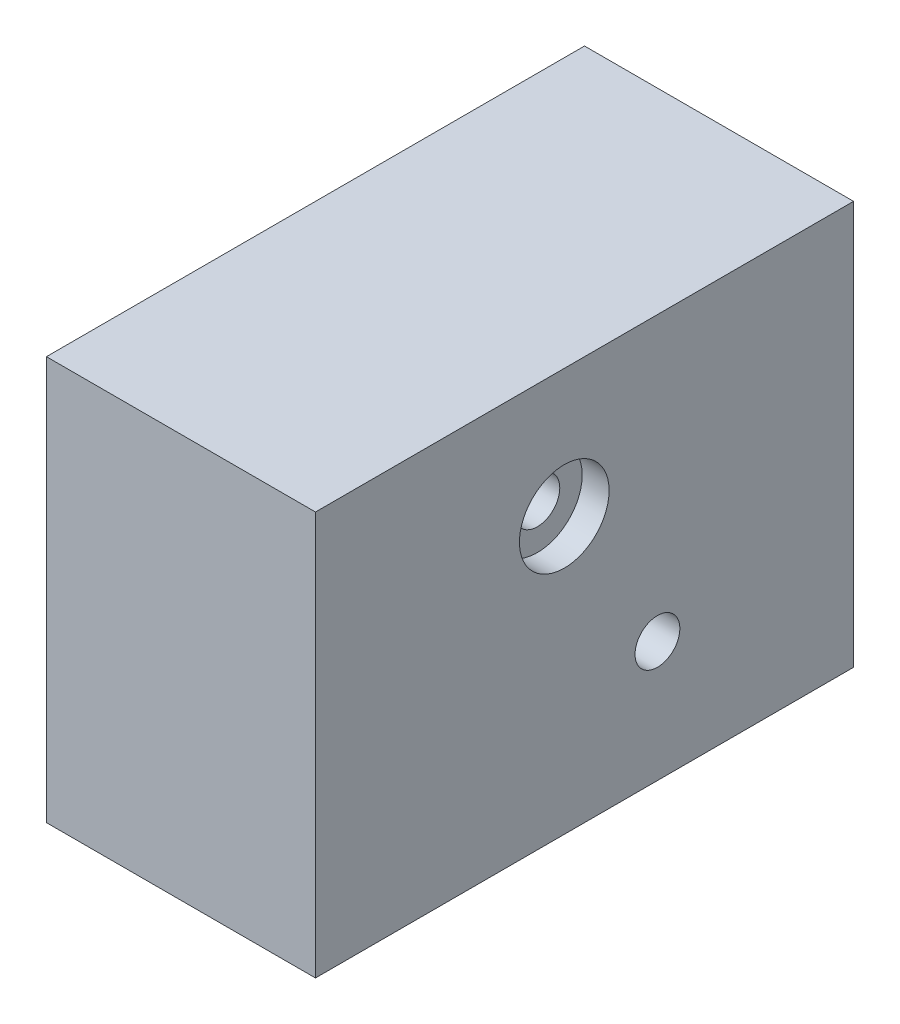
ISO-10303-21;
HEADER;
FILE_DESCRIPTION(('STEP AP214'),'2;1');
FILE_NAME('part.step','',(''),(''),'','','');
FILE_SCHEMA(('AUTOMOTIVE_DESIGN { 1 0 10303 214 1 1 1 1 }'));
ENDSEC;
DATA;
#1=APPLICATION_CONTEXT('core data for automotive mechanical design processes');
#2=APPLICATION_PROTOCOL_DEFINITION('international standard','automotive_design',2000,#1);
#3=PRODUCT_CONTEXT('',#1,'mechanical');
#4=PRODUCT('Part','Part','',(#3));
#5=PRODUCT_RELATED_PRODUCT_CATEGORY('part','',(#4));
#6=PRODUCT_DEFINITION_FORMATION('','',#4);
#7=PRODUCT_DEFINITION_CONTEXT('part definition',#1,'design');
#8=PRODUCT_DEFINITION('design','',#6,#7);
#9=PRODUCT_DEFINITION_SHAPE('','',#8);
#10=(LENGTH_UNIT() NAMED_UNIT(*) SI_UNIT(.MILLI.,.METRE.));
#11=(NAMED_UNIT(*) PLANE_ANGLE_UNIT() SI_UNIT($,.RADIAN.));
#12=(NAMED_UNIT(*) SI_UNIT($,.STERADIAN.) SOLID_ANGLE_UNIT());
#13=UNCERTAINTY_MEASURE_WITH_UNIT(LENGTH_MEASURE(1.E-05),#10,'distance_accuracy_value','');
#14=(GEOMETRIC_REPRESENTATION_CONTEXT(3) GLOBAL_UNCERTAINTY_ASSIGNED_CONTEXT((#13)) GLOBAL_UNIT_ASSIGNED_CONTEXT((#10,
#11,#12)) REPRESENTATION_CONTEXT('',''));
#15=CARTESIAN_POINT('',(0.,0.,0.));
#16=DIRECTION('',(0.,0.,1.));
#17=DIRECTION('',(1.,0.,0.));
#18=AXIS2_PLACEMENT_3D('',#15,#16,#17);
#19=CARTESIAN_POINT('',(-1.2E-05,85.7051553940905,122.259205921495));
#20=DIRECTION('',(1.,0.,0.));
#21=DIRECTION('',(0.,0.,-1.));
#22=AXIS2_PLACEMENT_3D('',#19,#20,#21);
#23=CYLINDRICAL_SURFACE('',#22,2.50000000000001);
#24=CARTESIAN_POINT('',(0.,85.7051553940905,122.259205921495));
#25=DIRECTION('',(1.,0.,0.));
#26=DIRECTION('',(0.,0.,-1.));
#27=AXIS2_PLACEMENT_3D('',#24,#25,#26);
#28=CIRCLE('',#27,2.50000000000001);
#29=CARTESIAN_POINT('',(0.,85.7051553940905,119.759205921495));
#30=VERTEX_POINT('',#29);
#31=EDGE_CURVE('E105',#30,#30,#28,.T.);
#32=CARTESIAN_POINT('',(27.,85.7051553940905,122.259205921495));
#33=DIRECTION('',(1.,0.,0.));
#34=DIRECTION('',(0.,0.,-1.));
#35=AXIS2_PLACEMENT_3D('',#32,#33,#34);
#36=CIRCLE('',#35,2.50000000000001);
#37=CARTESIAN_POINT('',(27.,85.7051553940905,119.759205921495));
#38=VERTEX_POINT('',#37);
#39=EDGE_CURVE('E39',#38,#38,#36,.F.);
#40=CARTESIAN_POINT('',(0.,85.7051553940905,119.759205921495));
#41=CARTESIAN_POINT('',(0.28125,85.7051553940905,119.759205921495));
#42=CARTESIAN_POINT('',(0.5625,85.7051553940905,119.759205921495));
#43=CARTESIAN_POINT('',(1.125,85.7051553940905,119.759205921495));
#44=CARTESIAN_POINT('',(1.40625,85.7051553940905,119.759205921495));
#45=CARTESIAN_POINT('',(1.96875,85.7051553940905,119.759205921495));
#46=CARTESIAN_POINT('',(2.25,85.7051553940905,119.759205921495));
#47=CARTESIAN_POINT('',(2.8125,85.7051553940905,119.759205921495));
#48=CARTESIAN_POINT('',(3.09375,85.7051553940905,119.759205921495));
#49=CARTESIAN_POINT('',(3.65625,85.7051553940905,119.759205921495));
#50=CARTESIAN_POINT('',(3.9375,85.7051553940905,119.759205921495));
#51=CARTESIAN_POINT('',(4.5,85.7051553940905,119.759205921495));
#52=CARTESIAN_POINT('',(4.78125,85.7051553940905,119.759205921495));
#53=CARTESIAN_POINT('',(5.34375,85.7051553940905,119.759205921495));
#54=CARTESIAN_POINT('',(5.625,85.7051553940905,119.759205921495));
#55=CARTESIAN_POINT('',(6.1875,85.7051553940905,119.759205921495));
#56=CARTESIAN_POINT('',(6.46875,85.7051553940905,119.759205921495));
#57=CARTESIAN_POINT('',(7.03125,85.7051553940905,119.759205921495));
#58=CARTESIAN_POINT('',(7.3125,85.7051553940905,119.759205921495));
#59=CARTESIAN_POINT('',(7.875,85.7051553940905,119.759205921495));
#60=CARTESIAN_POINT('',(8.15625,85.7051553940905,119.759205921495));
#61=CARTESIAN_POINT('',(8.71875,85.7051553940905,119.759205921495));
#62=CARTESIAN_POINT('',(9.,85.7051553940905,119.759205921495));
#63=CARTESIAN_POINT('',(9.5625,85.7051553940905,119.759205921495));
#64=CARTESIAN_POINT('',(9.84375,85.7051553940905,119.759205921495));
#65=CARTESIAN_POINT('',(10.40625,85.7051553940905,119.759205921495));
#66=CARTESIAN_POINT('',(10.6875,85.7051553940905,119.759205921495));
#67=CARTESIAN_POINT('',(11.25,85.7051553940905,119.759205921495));
#68=CARTESIAN_POINT('',(11.53125,85.7051553940905,119.759205921495));
#69=CARTESIAN_POINT('',(12.09375,85.7051553940905,119.759205921495));
#70=CARTESIAN_POINT('',(12.375,85.7051553940905,119.759205921495));
#71=CARTESIAN_POINT('',(12.9375,85.7051553940905,119.759205921495));
#72=CARTESIAN_POINT('',(13.21875,85.7051553940905,119.759205921495));
#73=CARTESIAN_POINT('',(13.78125,85.7051553940905,119.759205921495));
#74=CARTESIAN_POINT('',(14.0625,85.7051553940905,119.759205921495));
#75=CARTESIAN_POINT('',(14.625,85.7051553940905,119.759205921495));
#76=CARTESIAN_POINT('',(14.90625,85.7051553940905,119.759205921495));
#77=CARTESIAN_POINT('',(15.46875,85.7051553940905,119.759205921495));
#78=CARTESIAN_POINT('',(15.75,85.7051553940905,119.759205921495));
#79=CARTESIAN_POINT('',(16.3125,85.7051553940905,119.759205921495));
#80=CARTESIAN_POINT('',(16.59375,85.7051553940905,119.759205921495));
#81=CARTESIAN_POINT('',(17.15625,85.7051553940905,119.759205921495));
#82=CARTESIAN_POINT('',(17.4375,85.7051553940905,119.759205921495));
#83=CARTESIAN_POINT('',(18.,85.7051553940905,119.759205921495));
#84=CARTESIAN_POINT('',(18.28125,85.7051553940905,119.759205921495));
#85=CARTESIAN_POINT('',(18.84375,85.7051553940905,119.759205921495));
#86=CARTESIAN_POINT('',(19.125,85.7051553940905,119.759205921495));
#87=CARTESIAN_POINT('',(19.6875,85.7051553940905,119.759205921495));
#88=CARTESIAN_POINT('',(19.96875,85.7051553940905,119.759205921495));
#89=CARTESIAN_POINT('',(20.53125,85.7051553940905,119.759205921495));
#90=CARTESIAN_POINT('',(20.8125,85.7051553940905,119.759205921495));
#91=CARTESIAN_POINT('',(21.375,85.7051553940905,119.759205921495));
#92=CARTESIAN_POINT('',(21.65625,85.7051553940905,119.759205921495));
#93=CARTESIAN_POINT('',(22.21875,85.7051553940905,119.759205921495));
#94=CARTESIAN_POINT('',(22.5,85.7051553940905,119.759205921495));
#95=CARTESIAN_POINT('',(23.0625,85.7051553940905,119.759205921495));
#96=CARTESIAN_POINT('',(23.34375,85.7051553940905,119.759205921495));
#97=CARTESIAN_POINT('',(23.90625,85.7051553940905,119.759205921495));
#98=CARTESIAN_POINT('',(24.1875,85.7051553940905,119.759205921495));
#99=CARTESIAN_POINT('',(24.75,85.7051553940905,119.759205921495));
#100=CARTESIAN_POINT('',(25.03125,85.7051553940905,119.759205921495));
#101=CARTESIAN_POINT('',(25.59375,85.7051553940905,119.759205921495));
#102=CARTESIAN_POINT('',(25.875,85.7051553940905,119.759205921495));
#103=CARTESIAN_POINT('',(26.4375,85.7051553940905,119.759205921495));
#104=CARTESIAN_POINT('',(26.71875,85.7051553940905,119.759205921495));
#105=CARTESIAN_POINT('',(27.,85.7051553940905,119.759205921495));
#106=B_SPLINE_CURVE_WITH_KNOTS('',3,(#40,#41,#42,#43,#44,#45,#46,#47,#48,#49,#50,#51,#52,#53,
#54,#55,#56,#57,#58,#59,#60,#61,#62,#63,#64,#65,#66,#67,#68,#69,#70,#71,#72,#73,#74,#75,#76,#77,
#78,#79,#80,#81,#82,#83,#84,#85,#86,#87,#88,#89,#90,#91,#92,#93,#94,#95,#96,#97,#98,#99,#100,
#101,#102,#103,#104,#105),.UNSPECIFIED.,.F.,.F.,(4,2,2,2,2,2,2,2,2,2,2,2,2,2,2,2,2,2,2,2,2,2,2,
2,2,2,2,2,2,2,2,2,4),(0.,0.84375,1.6875,2.53125,3.375,4.21875,5.0625,5.90625,6.75,7.59375,
8.4375,9.28125,10.125,10.96875,11.8125,12.65625,13.5,14.34375,15.1875,16.03125,16.875,17.71875,
18.5625,19.40625,20.25,21.09375,21.9375,22.78125,23.625,24.46875,25.3125,26.15625,27.),.UNSPECIFIED.);
#107=EDGE_CURVE('BSEAM35',#30,#38,#106,.T.);
#108=ORIENTED_EDGE('',*,*,#31,.F.);
#109=ORIENTED_EDGE('',*,*,#39,.F.);
#110=ORIENTED_EDGE('',*,*,#107,.T.);
#111=ORIENTED_EDGE('',*,*,#107,.F.);
#112=EDGE_LOOP('',(#108,#110,#109,#111));
#113=FACE_BOUND('',#112,.T.);
#114=ADVANCED_FACE('F35',(#113),#23,.F.);
#115=CARTESIAN_POINT('',(-1.2E-05,68.4373066352128,111.869519883621));
#116=DIRECTION('',(1.,0.,0.));
#117=DIRECTION('',(0.,0.,-1.));
#118=AXIS2_PLACEMENT_3D('',#115,#116,#117);
#119=CYLINDRICAL_SURFACE('',#118,2.5);
#120=CARTESIAN_POINT('',(30.,68.4373066352128,111.869519883621));
#121=DIRECTION('',(1.,0.,0.));
#122=DIRECTION('',(0.,0.,-1.));
#123=AXIS2_PLACEMENT_3D('',#120,#121,#122);
#124=CIRCLE('',#123,2.5);
#125=CARTESIAN_POINT('',(30.,68.4373066352128,109.369519883621));
#126=VERTEX_POINT('',#125);
#127=EDGE_CURVE('E112',#126,#126,#124,.T.);
#128=CARTESIAN_POINT('',(3.,68.4373066352128,111.869519883621));
#129=DIRECTION('',(-1.,0.,0.));
#130=DIRECTION('',(0.,0.,1.));
#131=AXIS2_PLACEMENT_3D('',#128,#129,#130);
#132=CIRCLE('',#131,2.5);
#133=CARTESIAN_POINT('',(3.,68.4373066352128,109.369519883621));
#134=VERTEX_POINT('',#133);
#135=EDGE_CURVE('E113',#134,#134,#132,.F.);
#136=CARTESIAN_POINT('',(30.,68.4373066352128,109.369519883621));
#137=CARTESIAN_POINT('',(29.71875,68.4373066352128,109.369519883621));
#138=CARTESIAN_POINT('',(29.4375,68.4373066352128,109.369519883621));
#139=CARTESIAN_POINT('',(28.875,68.4373066352128,109.369519883621));
#140=CARTESIAN_POINT('',(28.59375,68.4373066352128,109.369519883621));
#141=CARTESIAN_POINT('',(28.03125,68.4373066352128,109.369519883621));
#142=CARTESIAN_POINT('',(27.75,68.4373066352128,109.369519883621));
#143=CARTESIAN_POINT('',(27.1875,68.4373066352128,109.369519883621));
#144=CARTESIAN_POINT('',(26.90625,68.4373066352128,109.369519883621));
#145=CARTESIAN_POINT('',(26.34375,68.4373066352128,109.369519883621));
#146=CARTESIAN_POINT('',(26.0625,68.4373066352128,109.369519883621));
#147=CARTESIAN_POINT('',(25.5,68.4373066352128,109.369519883621));
#148=CARTESIAN_POINT('',(25.21875,68.4373066352128,109.369519883621));
#149=CARTESIAN_POINT('',(24.65625,68.4373066352128,109.369519883621));
#150=CARTESIAN_POINT('',(24.375,68.4373066352128,109.369519883621));
#151=CARTESIAN_POINT('',(23.8125,68.4373066352128,109.369519883621));
#152=CARTESIAN_POINT('',(23.53125,68.4373066352128,109.369519883621));
#153=CARTESIAN_POINT('',(22.96875,68.4373066352128,109.369519883621));
#154=CARTESIAN_POINT('',(22.6875,68.4373066352128,109.369519883621));
#155=CARTESIAN_POINT('',(22.125,68.4373066352128,109.369519883621));
#156=CARTESIAN_POINT('',(21.84375,68.4373066352128,109.369519883621));
#157=CARTESIAN_POINT('',(21.28125,68.4373066352128,109.369519883621));
#158=CARTESIAN_POINT('',(21.,68.4373066352128,109.369519883621));
#159=CARTESIAN_POINT('',(20.4375,68.4373066352128,109.369519883621));
#160=CARTESIAN_POINT('',(20.15625,68.4373066352128,109.369519883621));
#161=CARTESIAN_POINT('',(19.59375,68.4373066352128,109.369519883621));
#162=CARTESIAN_POINT('',(19.3125,68.4373066352128,109.369519883621));
#163=CARTESIAN_POINT('',(18.75,68.4373066352128,109.369519883621));
#164=CARTESIAN_POINT('',(18.46875,68.4373066352128,109.369519883621));
#165=CARTESIAN_POINT('',(17.90625,68.4373066352128,109.369519883621));
#166=CARTESIAN_POINT('',(17.625,68.4373066352128,109.369519883621));
#167=CARTESIAN_POINT('',(17.0625,68.4373066352128,109.369519883621));
#168=CARTESIAN_POINT('',(16.78125,68.4373066352128,109.369519883621));
#169=CARTESIAN_POINT('',(16.21875,68.4373066352128,109.369519883621));
#170=CARTESIAN_POINT('',(15.9375,68.4373066352128,109.369519883621));
#171=CARTESIAN_POINT('',(15.375,68.4373066352128,109.369519883621));
#172=CARTESIAN_POINT('',(15.09375,68.4373066352128,109.369519883621));
#173=CARTESIAN_POINT('',(14.53125,68.4373066352128,109.369519883621));
#174=CARTESIAN_POINT('',(14.25,68.4373066352128,109.369519883621));
#175=CARTESIAN_POINT('',(13.6875,68.4373066352128,109.369519883621));
#176=CARTESIAN_POINT('',(13.40625,68.4373066352128,109.369519883621));
#177=CARTESIAN_POINT('',(12.84375,68.4373066352128,109.369519883621));
#178=CARTESIAN_POINT('',(12.5625,68.4373066352128,109.369519883621));
#179=CARTESIAN_POINT('',(12.,68.4373066352128,109.369519883621));
#180=CARTESIAN_POINT('',(11.71875,68.4373066352128,109.369519883621));
#181=CARTESIAN_POINT('',(11.15625,68.4373066352128,109.369519883621));
#182=CARTESIAN_POINT('',(10.875,68.4373066352128,109.369519883621));
#183=CARTESIAN_POINT('',(10.3125,68.4373066352128,109.369519883621));
#184=CARTESIAN_POINT('',(10.03125,68.4373066352128,109.369519883621));
#185=CARTESIAN_POINT('',(9.46875,68.4373066352128,109.369519883621));
#186=CARTESIAN_POINT('',(9.1875,68.4373066352128,109.369519883621));
#187=CARTESIAN_POINT('',(8.625,68.4373066352128,109.369519883621));
#188=CARTESIAN_POINT('',(8.34375,68.4373066352128,109.369519883621));
#189=CARTESIAN_POINT('',(7.78125,68.4373066352128,109.369519883621));
#190=CARTESIAN_POINT('',(7.5,68.4373066352128,109.369519883621));
#191=CARTESIAN_POINT('',(6.9375,68.4373066352128,109.369519883621));
#192=CARTESIAN_POINT('',(6.65625,68.4373066352128,109.369519883621));
#193=CARTESIAN_POINT('',(6.09375,68.4373066352128,109.369519883621));
#194=CARTESIAN_POINT('',(5.8125,68.4373066352128,109.369519883621));
#195=CARTESIAN_POINT('',(5.25,68.4373066352128,109.369519883621));
#196=CARTESIAN_POINT('',(4.96875,68.4373066352128,109.369519883621));
#197=CARTESIAN_POINT('',(4.40625,68.4373066352128,109.369519883621));
#198=CARTESIAN_POINT('',(4.125,68.4373066352128,109.369519883621));
#199=CARTESIAN_POINT('',(3.5625,68.4373066352128,109.369519883621));
#200=CARTESIAN_POINT('',(3.28125,68.4373066352128,109.369519883621));
#201=CARTESIAN_POINT('',(3.,68.4373066352128,109.369519883621));
#202=B_SPLINE_CURVE_WITH_KNOTS('',3,(#136,#137,#138,#139,#140,#141,#142,#143,#144,#145,#146,
#147,#148,#149,#150,#151,#152,#153,#154,#155,#156,#157,#158,#159,#160,#161,#162,#163,#164,#165,
#166,#167,#168,#169,#170,#171,#172,#173,#174,#175,#176,#177,#178,#179,#180,#181,#182,#183,#184,
#185,#186,#187,#188,#189,#190,#191,#192,#193,#194,#195,#196,#197,#198,#199,#200,#201),
.UNSPECIFIED.,.F.,.F.,(4,2,2,2,2,2,2,2,2,2,2,2,2,2,2,2,2,2,2,2,2,2,2,2,2,2,2,2,2,2,2,2,4),(0.,
0.843750000000001,1.6875,2.53125,3.375,4.21875,5.0625,5.90625,6.75,7.59375,8.4375,9.28125,
10.125,10.96875,11.8125,12.65625,13.5,14.34375,15.1875,16.03125,16.875,17.71875,18.5625,
19.40625,20.25,21.09375,21.9375,22.78125,23.625,24.46875,25.3125,26.15625,27.),.UNSPECIFIED.);
#203=EDGE_CURVE('BSEAM141',#126,#134,#202,.T.);
#204=ORIENTED_EDGE('',*,*,#127,.T.);
#205=ORIENTED_EDGE('',*,*,#135,.F.);
#206=ORIENTED_EDGE('',*,*,#203,.T.);
#207=ORIENTED_EDGE('',*,*,#203,.F.);
#208=EDGE_LOOP('',(#204,#206,#205,#207));
#209=FACE_BOUND('',#208,.T.);
#210=ADVANCED_FACE('F141',(#209),#119,.F.);
#211=CARTESIAN_POINT('',(30.,100.,90.));
#212=DIRECTION('',(0.,-1.,0.));
#213=DIRECTION('',(0.,0.,-1.));
#214=AXIS2_PLACEMENT_3D('',#211,#212,#213);
#215=PLANE('',#214);
#216=DIRECTION('',(0.,0.,1.));
#217=VECTOR('',#216,1.);
#218=CARTESIAN_POINT('',(0.,100.,90.));
#219=LINE('',#218,#217);
#220=CARTESIAN_POINT('',(0.,100.,90.));
#221=VERTEX_POINT('',#220);
#222=CARTESIAN_POINT('',(0.,100.,150.));
#223=VERTEX_POINT('',#222);
#224=EDGE_CURVE('E102',#221,#223,#219,.T.);
#225=ORIENTED_EDGE('',*,*,#224,.T.);
#226=DIRECTION('',(-1.,0.,0.));
#227=VECTOR('',#226,1.);
#228=CARTESIAN_POINT('',(30.,100.,150.));
#229=LINE('',#228,#227);
#230=CARTESIAN_POINT('',(30.,100.,150.));
#231=VERTEX_POINT('',#230);
#232=EDGE_CURVE('E11',#231,#223,#229,.T.);
#233=ORIENTED_EDGE('',*,*,#232,.F.);
#234=DIRECTION('',(0.,0.,1.));
#235=VECTOR('',#234,1.);
#236=CARTESIAN_POINT('',(30.,100.,90.));
#237=LINE('',#236,#235);
#238=CARTESIAN_POINT('',(30.,100.,90.));
#239=VERTEX_POINT('',#238);
#240=EDGE_CURVE('E89',#239,#231,#237,.T.);
#241=ORIENTED_EDGE('',*,*,#240,.F.);
#242=DIRECTION('',(-1.,0.,0.));
#243=VECTOR('',#242,1.);
#244=CARTESIAN_POINT('',(30.,100.,90.));
#245=LINE('',#244,#243);
#246=EDGE_CURVE('E98',#239,#221,#245,.T.);
#247=ORIENTED_EDGE('',*,*,#246,.T.);
#248=EDGE_LOOP('',(#225,#233,#241,#247));
#249=FACE_BOUND('',#248,.T.);
#250=ADVANCED_FACE('F37',(#249),#215,.F.);
#251=CARTESIAN_POINT('',(30.,100.,150.));
#252=DIRECTION('',(0.,0.,-1.));
#253=DIRECTION('',(-1.,0.,0.));
#254=AXIS2_PLACEMENT_3D('',#251,#252,#253);
#255=PLANE('',#254);
#256=DIRECTION('',(0.,-1.,0.));
#257=VECTOR('',#256,1.);
#258=CARTESIAN_POINT('',(0.,100.,150.));
#259=LINE('',#258,#257);
#260=CARTESIAN_POINT('',(0.,55.,150.));
#261=VERTEX_POINT('',#260);
#262=EDGE_CURVE('E93',#223,#261,#259,.T.);
#263=ORIENTED_EDGE('',*,*,#262,.T.);
#264=DIRECTION('',(-1.,0.,0.));
#265=VECTOR('',#264,1.);
#266=CARTESIAN_POINT('',(30.,55.,150.));
#267=LINE('',#266,#265);
#268=CARTESIAN_POINT('',(30.,55.,150.));
#269=VERTEX_POINT('',#268);
#270=EDGE_CURVE('E45',#269,#261,#267,.T.);
#271=ORIENTED_EDGE('',*,*,#270,.F.);
#272=DIRECTION('',(0.,-1.,0.));
#273=VECTOR('',#272,1.);
#274=CARTESIAN_POINT('',(30.,100.,150.));
#275=LINE('',#274,#273);
#276=EDGE_CURVE('E84',#231,#269,#275,.T.);
#277=ORIENTED_EDGE('',*,*,#276,.F.);
#278=ORIENTED_EDGE('',*,*,#232,.T.);
#279=EDGE_LOOP('',(#263,#271,#277,#278));
#280=FACE_BOUND('',#279,.T.);
#281=ADVANCED_FACE('F92',(#280),#255,.F.);
#282=CARTESIAN_POINT('',(30.,55.,90.));
#283=DIRECTION('',(0.,1.,0.));
#284=DIRECTION('',(0.,0.,1.));
#285=AXIS2_PLACEMENT_3D('',#282,#283,#284);
#286=PLANE('',#285);
#287=DIRECTION('',(0.,0.,-1.));
#288=VECTOR('',#287,1.);
#289=CARTESIAN_POINT('',(0.,55.,90.));
#290=LINE('',#289,#288);
#291=CARTESIAN_POINT('',(0.,55.,90.));
#292=VERTEX_POINT('',#291);
#293=EDGE_CURVE('E71',#261,#292,#290,.T.);
#294=ORIENTED_EDGE('',*,*,#293,.T.);
#295=DIRECTION('',(-1.,0.,0.));
#296=VECTOR('',#295,1.);
#297=CARTESIAN_POINT('',(30.,55.,90.));
#298=LINE('',#297,#296);
#299=CARTESIAN_POINT('',(30.,55.,90.));
#300=VERTEX_POINT('',#299);
#301=EDGE_CURVE('E94',#300,#292,#298,.T.);
#302=ORIENTED_EDGE('',*,*,#301,.F.);
#303=DIRECTION('',(0.,0.,-1.));
#304=VECTOR('',#303,1.);
#305=CARTESIAN_POINT('',(30.,55.,90.));
#306=LINE('',#305,#304);
#307=EDGE_CURVE('E87',#269,#300,#306,.T.);
#308=ORIENTED_EDGE('',*,*,#307,.F.);
#309=ORIENTED_EDGE('',*,*,#270,.T.);
#310=EDGE_LOOP('',(#294,#302,#308,#309));
#311=FACE_BOUND('',#310,.T.);
#312=ADVANCED_FACE('F96',(#311),#286,.F.);
#313=CARTESIAN_POINT('',(30.,100.,90.));
#314=DIRECTION('',(0.,0.,1.));
#315=DIRECTION('',(1.,0.,0.));
#316=AXIS2_PLACEMENT_3D('',#313,#314,#315);
#317=PLANE('',#316);
#318=DIRECTION('',(0.,1.,0.));
#319=VECTOR('',#318,1.);
#320=CARTESIAN_POINT('',(0.,100.,90.));
#321=LINE('',#320,#319);
#322=EDGE_CURVE('E77',#292,#221,#321,.T.);
#323=ORIENTED_EDGE('',*,*,#322,.T.);
#324=ORIENTED_EDGE('',*,*,#246,.F.);
#325=DIRECTION('',(0.,1.,0.));
#326=VECTOR('',#325,1.);
#327=CARTESIAN_POINT('',(30.,100.,90.));
#328=LINE('',#327,#326);
#329=EDGE_CURVE('E54',#300,#239,#328,.T.);
#330=ORIENTED_EDGE('',*,*,#329,.F.);
#331=ORIENTED_EDGE('',*,*,#301,.T.);
#332=EDGE_LOOP('',(#323,#324,#330,#331));
#333=FACE_BOUND('',#332,.T.);
#334=ADVANCED_FACE('F155',(#333),#317,.F.);
#335=CARTESIAN_POINT('',(30.,0.,0.));
#336=DIRECTION('',(1.,0.,0.));
#337=DIRECTION('',(0.,0.,-1.));
#338=AXIS2_PLACEMENT_3D('',#335,#336,#337);
#339=PLANE('',#338);
#340=CARTESIAN_POINT('',(30.,85.7051553940905,122.259205921495));
#341=DIRECTION('',(1.,0.,0.));
#342=DIRECTION('',(0.,0.,-1.));
#343=AXIS2_PLACEMENT_3D('',#340,#341,#342);
#344=CIRCLE('',#343,5.00000000000001);
#345=CARTESIAN_POINT('',(30.,85.7051553940905,117.259205921495));
#346=VERTEX_POINT('',#345);
#347=EDGE_CURVE('E128',#346,#346,#344,.T.);
#348=ORIENTED_EDGE('',*,*,#347,.F.);
#349=EDGE_LOOP('',(#348));
#350=FACE_BOUND('',#349,.T.);
#351=ORIENTED_EDGE('',*,*,#127,.F.);
#352=EDGE_LOOP('',(#351));
#353=FACE_BOUND('',#352,.T.);
#354=ORIENTED_EDGE('',*,*,#240,.T.);
#355=ORIENTED_EDGE('',*,*,#276,.T.);
#356=ORIENTED_EDGE('',*,*,#307,.T.);
#357=ORIENTED_EDGE('',*,*,#329,.T.);
#358=EDGE_LOOP('',(#354,#355,#356,#357));
#359=FACE_BOUND('',#358,.T.);
#360=ADVANCED_FACE('F85',(#350,#353,#359),#339,.T.);
#361=CARTESIAN_POINT('',(0.,0.,0.));
#362=DIRECTION('',(1.,0.,0.));
#363=DIRECTION('',(0.,0.,-1.));
#364=AXIS2_PLACEMENT_3D('',#361,#362,#363);
#365=PLANE('',#364);
#366=CARTESIAN_POINT('',(0.,68.4373066352128,111.869519883621));
#367=DIRECTION('',(-1.,0.,0.));
#368=DIRECTION('',(0.,0.,1.));
#369=AXIS2_PLACEMENT_3D('',#366,#367,#368);
#370=CIRCLE('',#369,5.00000000000001);
#371=CARTESIAN_POINT('',(0.,68.4373066352128,116.869519883621));
#372=VERTEX_POINT('',#371);
#373=EDGE_CURVE('E121',#372,#372,#370,.T.);
#374=ORIENTED_EDGE('',*,*,#373,.F.);
#375=EDGE_LOOP('',(#374));
#376=FACE_BOUND('',#375,.T.);
#377=ORIENTED_EDGE('',*,*,#31,.T.);
#378=EDGE_LOOP('',(#377));
#379=FACE_BOUND('',#378,.T.);
#380=ORIENTED_EDGE('',*,*,#224,.F.);
#381=ORIENTED_EDGE('',*,*,#322,.F.);
#382=ORIENTED_EDGE('',*,*,#293,.F.);
#383=ORIENTED_EDGE('',*,*,#262,.F.);
#384=EDGE_LOOP('',(#380,#381,#382,#383));
#385=FACE_BOUND('',#384,.T.);
#386=ADVANCED_FACE('F154',(#376,#379,#385),#365,.F.);
#387=CARTESIAN_POINT('',(3.,68.4373066352128,111.869519883621));
#388=DIRECTION('',(-1.,0.,0.));
#389=DIRECTION('',(0.,0.,1.));
#390=AXIS2_PLACEMENT_3D('',#387,#388,#389);
#391=PLANE('',#390);
#392=CARTESIAN_POINT('',(3.,68.4373066352128,111.869519883621));
#393=DIRECTION('',(-1.,0.,0.));
#394=DIRECTION('',(0.,0.,1.));
#395=AXIS2_PLACEMENT_3D('',#392,#393,#394);
#396=CIRCLE('',#395,5.00000000000001);
#397=CARTESIAN_POINT('',(3.,68.4373066352128,116.869519883621));
#398=VERTEX_POINT('',#397);
#399=EDGE_CURVE('E115',#398,#398,#396,.T.);
#400=ORIENTED_EDGE('',*,*,#399,.T.);
#401=EDGE_LOOP('',(#400));
#402=FACE_BOUND('',#401,.T.);
#403=ORIENTED_EDGE('',*,*,#135,.T.);
#404=EDGE_LOOP('',(#403));
#405=FACE_BOUND('',#404,.T.);
#406=ADVANCED_FACE('F159',(#402,#405),#391,.T.);
#407=CARTESIAN_POINT('',(3.,68.4373066352128,111.869519883621));
#408=DIRECTION('',(-1.,0.,0.));
#409=DIRECTION('',(0.,0.,1.));
#410=AXIS2_PLACEMENT_3D('',#407,#408,#409);
#411=CYLINDRICAL_SURFACE('',#410,5.00000000000001);
#412=ORIENTED_EDGE('',*,*,#399,.F.);
#413=EDGE_LOOP('',(#412));
#414=FACE_BOUND('',#413,.T.);
#415=ORIENTED_EDGE('',*,*,#373,.T.);
#416=EDGE_LOOP('',(#415));
#417=FACE_BOUND('',#416,.T.);
#418=ADVANCED_FACE('F197',(#414,#417),#411,.F.);
#419=CARTESIAN_POINT('',(27.,85.7051553940905,122.259205921495));
#420=DIRECTION('',(1.,0.,0.));
#421=DIRECTION('',(0.,0.,-1.));
#422=AXIS2_PLACEMENT_3D('',#419,#420,#421);
#423=PLANE('',#422);
#424=CARTESIAN_POINT('',(27.,85.7051553940905,122.259205921495));
#425=DIRECTION('',(1.,0.,0.));
#426=DIRECTION('',(0.,0.,-1.));
#427=AXIS2_PLACEMENT_3D('',#424,#425,#426);
#428=CIRCLE('',#427,5.00000000000001);
#429=CARTESIAN_POINT('',(27.,85.7051553940905,117.259205921495));
#430=VERTEX_POINT('',#429);
#431=EDGE_CURVE('E131',#430,#430,#428,.T.);
#432=ORIENTED_EDGE('',*,*,#431,.T.);
#433=EDGE_LOOP('',(#432));
#434=FACE_BOUND('',#433,.T.);
#435=ORIENTED_EDGE('',*,*,#39,.T.);
#436=EDGE_LOOP('',(#435));
#437=FACE_BOUND('',#436,.T.);
#438=ADVANCED_FACE('F138',(#434,#437),#423,.T.);
#439=CARTESIAN_POINT('',(27.,85.7051553940905,122.259205921495));
#440=DIRECTION('',(1.,0.,0.));
#441=DIRECTION('',(0.,0.,-1.));
#442=AXIS2_PLACEMENT_3D('',#439,#440,#441);
#443=CYLINDRICAL_SURFACE('',#442,5.00000000000001);
#444=ORIENTED_EDGE('',*,*,#431,.F.);
#445=EDGE_LOOP('',(#444));
#446=FACE_BOUND('',#445,.T.);
#447=ORIENTED_EDGE('',*,*,#347,.T.);
#448=EDGE_LOOP('',(#447));
#449=FACE_BOUND('',#448,.T.);
#450=ADVANCED_FACE('F223',(#446,#449),#443,.F.);
#451=CLOSED_SHELL('',(#114,#210,#250,#281,#312,#334,#360,#386,#406,#418,#438,#450));
#452=MANIFOLD_SOLID_BREP('B2',#451);
#453=ADVANCED_BREP_SHAPE_REPRESENTATION('',(#18,#452),#14);
#454=SHAPE_DEFINITION_REPRESENTATION(#9,#453);
ENDSEC;
END-ISO-10303-21;
